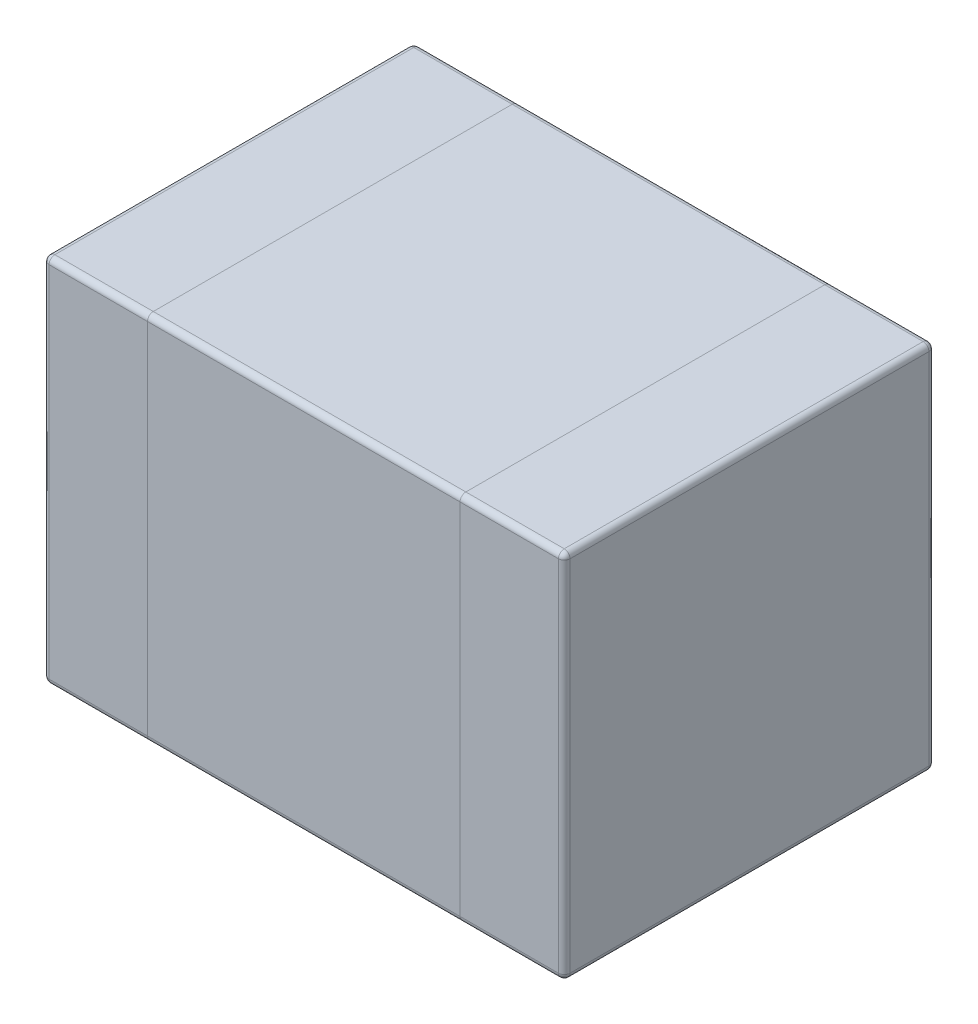
ISO-10303-21;
HEADER;
FILE_DESCRIPTION(('STEP AP214'),'2;1');
FILE_NAME('part.step','',(''),(''),'','','');
FILE_SCHEMA(('AUTOMOTIVE_DESIGN { 1 0 10303 214 1 1 1 1 }'));
ENDSEC;
DATA;
#1=APPLICATION_CONTEXT('core data for automotive mechanical design processes');
#2=APPLICATION_PROTOCOL_DEFINITION('international standard','automotive_design',2000,#1);
#3=PRODUCT_CONTEXT('',#1,'mechanical');
#4=PRODUCT('Part','Part','',(#3));
#5=PRODUCT_RELATED_PRODUCT_CATEGORY('part','',(#4));
#6=PRODUCT_DEFINITION_FORMATION('','',#4);
#7=PRODUCT_DEFINITION_CONTEXT('part definition',#1,'design');
#8=PRODUCT_DEFINITION('design','',#6,#7);
#9=PRODUCT_DEFINITION_SHAPE('','',#8);
#10=(LENGTH_UNIT() NAMED_UNIT(*) SI_UNIT(.MILLI.,.METRE.));
#11=(NAMED_UNIT(*) PLANE_ANGLE_UNIT() SI_UNIT($,.RADIAN.));
#12=(NAMED_UNIT(*) SI_UNIT($,.STERADIAN.) SOLID_ANGLE_UNIT());
#13=UNCERTAINTY_MEASURE_WITH_UNIT(LENGTH_MEASURE(1.E-05),#10,'distance_accuracy_value','');
#14=(GEOMETRIC_REPRESENTATION_CONTEXT(3) GLOBAL_UNCERTAINTY_ASSIGNED_CONTEXT((#13)) GLOBAL_UNIT_ASSIGNED_CONTEXT((#10,
#11,#12)) REPRESENTATION_CONTEXT('',''));
#15=CARTESIAN_POINT('',(0.,0.,0.));
#16=DIRECTION('',(0.,0.,1.));
#17=DIRECTION('',(1.,0.,0.));
#18=AXIS2_PLACEMENT_3D('',#15,#16,#17);
#19=CARTESIAN_POINT('',(2.25,3.2,-1.6));
#20=DIRECTION('',(0.,-1.,0.));
#21=DIRECTION('',(0.,0.,-1.));
#22=AXIS2_PLACEMENT_3D('',#19,#20,#21);
#23=PLANE('',#22);
#24=DIRECTION('',(0.,0.,1.));
#25=VECTOR('',#24,1.);
#26=CARTESIAN_POINT('',(-1.35,3.2,-1.6));
#27=LINE('',#26,#25);
#28=CARTESIAN_POINT('',(-1.35,3.2,-1.55));
#29=VERTEX_POINT('',#28);
#30=CARTESIAN_POINT('',(-1.35,3.2,1.55));
#31=VERTEX_POINT('',#30);
#32=EDGE_CURVE('E11',#29,#31,#27,.T.);
#33=ORIENTED_EDGE('',*,*,#32,.F.);
#34=DIRECTION('',(-1.,0.,0.));
#35=VECTOR('',#34,1.);
#36=CARTESIAN_POINT('',(2.25,3.2,-1.55));
#37=LINE('',#36,#35);
#38=CARTESIAN_POINT('',(-2.2,3.2,-1.55));
#39=VERTEX_POINT('',#38);
#40=EDGE_CURVE('E255',#29,#39,#37,.T.);
#41=ORIENTED_EDGE('',*,*,#40,.T.);
#42=DIRECTION('',(0.,0.,1.));
#43=VECTOR('',#42,1.);
#44=CARTESIAN_POINT('',(-2.2,3.2,-1.6));
#45=LINE('',#44,#43);
#46=CARTESIAN_POINT('',(-2.2,3.2,1.55));
#47=VERTEX_POINT('',#46);
#48=EDGE_CURVE('E258',#39,#47,#45,.T.);
#49=ORIENTED_EDGE('',*,*,#48,.T.);
#50=DIRECTION('',(1.,0.,0.));
#51=VECTOR('',#50,1.);
#52=CARTESIAN_POINT('',(2.25,3.2,1.55));
#53=LINE('',#52,#51);
#54=EDGE_CURVE('E262',#47,#31,#53,.T.);
#55=ORIENTED_EDGE('',*,*,#54,.T.);
#56=EDGE_LOOP('',(#33,#41,#49,#55));
#57=FACE_BOUND('',#56,.T.);
#58=ADVANCED_FACE('F39',(#57),#23,.F.);
#59=DIRECTION('',(0.,0.,-1.));
#60=VECTOR('',#59,1.);
#61=CARTESIAN_POINT('',(1.35,3.2,-1.6));
#62=LINE('',#61,#60);
#63=CARTESIAN_POINT('',(1.35,3.2,1.55));
#64=VERTEX_POINT('',#63);
#65=CARTESIAN_POINT('',(1.35,3.2,-1.55));
#66=VERTEX_POINT('',#65);
#67=EDGE_CURVE('E49',#64,#66,#62,.T.);
#68=ORIENTED_EDGE('',*,*,#67,.F.);
#69=CARTESIAN_POINT('',(2.2,3.2,1.55));
#70=VERTEX_POINT('',#69);
#71=EDGE_CURVE('E261',#64,#70,#53,.T.);
#72=ORIENTED_EDGE('',*,*,#71,.T.);
#73=DIRECTION('',(0.,0.,-1.));
#74=VECTOR('',#73,1.);
#75=CARTESIAN_POINT('',(2.2,3.2,-1.6));
#76=LINE('',#75,#74);
#77=CARTESIAN_POINT('',(2.2,3.2,-1.55));
#78=VERTEX_POINT('',#77);
#79=EDGE_CURVE('E252',#70,#78,#76,.T.);
#80=ORIENTED_EDGE('',*,*,#79,.T.);
#81=EDGE_CURVE('E256',#78,#66,#37,.T.);
#82=ORIENTED_EDGE('',*,*,#81,.T.);
#83=EDGE_LOOP('',(#68,#72,#80,#82));
#84=FACE_BOUND('',#83,.T.);
#85=ADVANCED_FACE('F528',(#84),#23,.F.);
#86=CARTESIAN_POINT('',(2.25,3.15,1.55));
#87=DIRECTION('',(1.,0.,0.));
#88=DIRECTION('',(0.,0.,-1.));
#89=AXIS2_PLACEMENT_3D('',#86,#87,#88);
#90=CYLINDRICAL_SURFACE('',#89,0.05);
#91=DIRECTION('',(1.,0.,0.));
#92=VECTOR('',#91,1.);
#93=CARTESIAN_POINT('',(-2.25,3.15,1.6));
#94=LINE('',#93,#92);
#95=CARTESIAN_POINT('',(-1.35,3.15,1.6));
#96=VERTEX_POINT('',#95);
#97=CARTESIAN_POINT('',(-2.2,3.15,1.6));
#98=VERTEX_POINT('',#97);
#99=EDGE_CURVE('E248',#96,#98,#94,.F.);
#100=ORIENTED_EDGE('',*,*,#99,.F.);
#101=CARTESIAN_POINT('',(-1.35,3.15,1.55));
#102=DIRECTION('',(1.,0.,0.));
#103=DIRECTION('',(0.,0.,-1.));
#104=AXIS2_PLACEMENT_3D('',#101,#102,#103);
#105=CIRCLE('',#104,0.05);
#106=EDGE_CURVE('E356',#96,#31,#105,.F.);
#107=ORIENTED_EDGE('',*,*,#106,.T.);
#108=ORIENTED_EDGE('',*,*,#54,.F.);
#109=CARTESIAN_POINT('',(-2.2,3.15,1.55));
#110=DIRECTION('',(-1.,0.,0.));
#111=DIRECTION('',(0.,-1.,0.));
#112=AXIS2_PLACEMENT_3D('',#109,#110,#111);
#113=CIRCLE('',#112,0.05);
#114=EDGE_CURVE('E332',#47,#98,#113,.F.);
#115=ORIENTED_EDGE('',*,*,#114,.T.);
#116=EDGE_LOOP('',(#100,#107,#108,#115));
#117=FACE_BOUND('',#116,.T.);
#118=ADVANCED_FACE('F485',(#117),#90,.T.);
#119=ORIENTED_EDGE('',*,*,#71,.F.);
#120=CARTESIAN_POINT('',(1.35,3.15,1.55));
#121=DIRECTION('',(-1.,0.,0.));
#122=DIRECTION('',(0.,0.,1.));
#123=AXIS2_PLACEMENT_3D('',#120,#121,#122);
#124=CIRCLE('',#123,0.05);
#125=CARTESIAN_POINT('',(1.35,3.15,1.6));
#126=VERTEX_POINT('',#125);
#127=EDGE_CURVE('E355',#64,#126,#124,.F.);
#128=ORIENTED_EDGE('',*,*,#127,.T.);
#129=CARTESIAN_POINT('',(2.2,3.15,1.6));
#130=VERTEX_POINT('',#129);
#131=EDGE_CURVE('E249',#130,#126,#94,.F.);
#132=ORIENTED_EDGE('',*,*,#131,.F.);
#133=CARTESIAN_POINT('',(2.2,3.15,1.55));
#134=DIRECTION('',(1.,0.,0.));
#135=DIRECTION('',(0.,0.,-1.));
#136=AXIS2_PLACEMENT_3D('',#133,#134,#135);
#137=CIRCLE('',#136,0.05);
#138=EDGE_CURVE('E317',#70,#130,#137,.T.);
#139=ORIENTED_EDGE('',*,*,#138,.F.);
#140=EDGE_LOOP('',(#119,#128,#132,#139));
#141=FACE_BOUND('',#140,.T.);
#142=ADVANCED_FACE('F459',(#141),#90,.T.);
#143=CARTESIAN_POINT('',(-2.25,3.2,1.6));
#144=DIRECTION('',(0.,0.,-1.));
#145=DIRECTION('',(-1.,0.,0.));
#146=AXIS2_PLACEMENT_3D('',#143,#144,#145);
#147=PLANE('',#146);
#148=DIRECTION('',(0.,-1.,0.));
#149=VECTOR('',#148,1.);
#150=CARTESIAN_POINT('',(-1.35,3.2,1.6));
#151=LINE('',#150,#149);
#152=CARTESIAN_POINT('',(-1.35,0.0500000000000001,1.6));
#153=VERTEX_POINT('',#152);
#154=EDGE_CURVE('E351',#96,#153,#151,.T.);
#155=ORIENTED_EDGE('',*,*,#154,.F.);
#156=ORIENTED_EDGE('',*,*,#99,.T.);
#157=DIRECTION('',(0.,-1.,0.));
#158=VECTOR('',#157,1.);
#159=CARTESIAN_POINT('',(-2.2,3.2,1.6));
#160=LINE('',#159,#158);
#161=CARTESIAN_POINT('',(-2.2,0.0500000000000001,1.6));
#162=VERTEX_POINT('',#161);
#163=EDGE_CURVE('E245',#98,#162,#160,.T.);
#164=ORIENTED_EDGE('',*,*,#163,.T.);
#165=DIRECTION('',(1.,0.,0.));
#166=VECTOR('',#165,1.);
#167=CARTESIAN_POINT('',(2.25,0.0500000000000001,1.6));
#168=LINE('',#167,#166);
#169=EDGE_CURVE('E239',#162,#153,#168,.T.);
#170=ORIENTED_EDGE('',*,*,#169,.T.);
#171=EDGE_LOOP('',(#155,#156,#164,#170));
#172=FACE_BOUND('',#171,.T.);
#173=ADVANCED_FACE('F473',(#172),#147,.F.);
#174=DIRECTION('',(0.,1.,0.));
#175=VECTOR('',#174,1.);
#176=CARTESIAN_POINT('',(1.35,3.2,1.6));
#177=LINE('',#176,#175);
#178=CARTESIAN_POINT('',(1.35,0.0500000000000001,1.6));
#179=VERTEX_POINT('',#178);
#180=EDGE_CURVE('E347',#179,#126,#177,.T.);
#181=ORIENTED_EDGE('',*,*,#180,.F.);
#182=CARTESIAN_POINT('',(2.2,0.0500000000000001,1.6));
#183=VERTEX_POINT('',#182);
#184=EDGE_CURVE('E238',#179,#183,#168,.T.);
#185=ORIENTED_EDGE('',*,*,#184,.T.);
#186=DIRECTION('',(0.,-1.,0.));
#187=VECTOR('',#186,1.);
#188=CARTESIAN_POINT('',(2.2,3.2,1.6));
#189=LINE('',#188,#187);
#190=EDGE_CURVE('E242',#183,#130,#189,.F.);
#191=ORIENTED_EDGE('',*,*,#190,.T.);
#192=ORIENTED_EDGE('',*,*,#131,.T.);
#193=EDGE_LOOP('',(#181,#185,#191,#192));
#194=FACE_BOUND('',#193,.T.);
#195=ADVANCED_FACE('F455',(#194),#147,.F.);
#196=CARTESIAN_POINT('',(-2.25,0.0500000000000001,1.55));
#197=DIRECTION('',(-1.,0.,0.));
#198=DIRECTION('',(0.,0.,1.));
#199=AXIS2_PLACEMENT_3D('',#196,#197,#198);
#200=CYLINDRICAL_SURFACE('',#199,0.05);
#201=DIRECTION('',(1.,0.,0.));
#202=VECTOR('',#201,1.);
#203=CARTESIAN_POINT('',(-2.25,0.,1.55));
#204=LINE('',#203,#202);
#205=CARTESIAN_POINT('',(-1.35,0.,1.55));
#206=VERTEX_POINT('',#205);
#207=CARTESIAN_POINT('',(-2.2,0.,1.55));
#208=VERTEX_POINT('',#207);
#209=EDGE_CURVE('E268',#206,#208,#204,.F.);
#210=ORIENTED_EDGE('',*,*,#209,.F.);
#211=CARTESIAN_POINT('',(-1.35,0.0500000000000001,1.55));
#212=DIRECTION('',(1.,0.,0.));
#213=DIRECTION('',(0.,0.,-1.));
#214=AXIS2_PLACEMENT_3D('',#211,#212,#213);
#215=CIRCLE('',#214,0.05);
#216=EDGE_CURVE('E352',#206,#153,#215,.F.);
#217=ORIENTED_EDGE('',*,*,#216,.T.);
#218=ORIENTED_EDGE('',*,*,#169,.F.);
#219=CARTESIAN_POINT('',(-2.2,0.05,1.55));
#220=DIRECTION('',(-1.,0.,0.));
#221=DIRECTION('',(0.,0.,1.));
#222=AXIS2_PLACEMENT_3D('',#219,#220,#221);
#223=CIRCLE('',#222,0.05);
#224=EDGE_CURVE('E323',#162,#208,#223,.F.);
#225=ORIENTED_EDGE('',*,*,#224,.T.);
#226=EDGE_LOOP('',(#210,#217,#218,#225));
#227=FACE_BOUND('',#226,.T.);
#228=ADVANCED_FACE('F511',(#227),#200,.T.);
#229=ORIENTED_EDGE('',*,*,#184,.F.);
#230=CARTESIAN_POINT('',(1.35,0.0500000000000001,1.55));
#231=DIRECTION('',(-1.,0.,0.));
#232=DIRECTION('',(0.,0.,1.));
#233=AXIS2_PLACEMENT_3D('',#230,#231,#232);
#234=CIRCLE('',#233,0.05);
#235=CARTESIAN_POINT('',(1.35,0.,1.55));
#236=VERTEX_POINT('',#235);
#237=EDGE_CURVE('E367',#179,#236,#234,.F.);
#238=ORIENTED_EDGE('',*,*,#237,.T.);
#239=CARTESIAN_POINT('',(2.2,0.,1.55));
#240=VERTEX_POINT('',#239);
#241=EDGE_CURVE('E269',#240,#236,#204,.F.);
#242=ORIENTED_EDGE('',*,*,#241,.F.);
#243=CARTESIAN_POINT('',(2.2,0.0500000000000001,1.55));
#244=DIRECTION('',(1.,0.,0.));
#245=DIRECTION('',(0.,0.,-1.));
#246=AXIS2_PLACEMENT_3D('',#243,#244,#245);
#247=CIRCLE('',#246,0.05);
#248=EDGE_CURVE('E303',#183,#240,#247,.T.);
#249=ORIENTED_EDGE('',*,*,#248,.F.);
#250=EDGE_LOOP('',(#229,#238,#242,#249));
#251=FACE_BOUND('',#250,.T.);
#252=ADVANCED_FACE('F445',(#251),#200,.T.);
#253=CARTESIAN_POINT('',(2.25,0.,-1.6));
#254=DIRECTION('',(0.,-1.,0.));
#255=DIRECTION('',(0.,0.,-1.));
#256=AXIS2_PLACEMENT_3D('',#253,#254,#255);
#257=PLANE('',#256);
#258=DIRECTION('',(-1.,0.,0.));
#259=VECTOR('',#258,1.);
#260=CARTESIAN_POINT('',(2.25,0.,-1.55));
#261=LINE('',#260,#259);
#262=CARTESIAN_POINT('',(-2.2,0.,-1.55));
#263=VERTEX_POINT('',#262);
#264=CARTESIAN_POINT('',(-1.35,0.,-1.55));
#265=VERTEX_POINT('',#264);
#266=EDGE_CURVE('E276',#263,#265,#261,.F.);
#267=ORIENTED_EDGE('',*,*,#266,.T.);
#268=DIRECTION('',(0.,0.,1.));
#269=VECTOR('',#268,1.);
#270=CARTESIAN_POINT('',(-1.35,0.,-1.6));
#271=LINE('',#270,#269);
#272=EDGE_CURVE('E368',#265,#206,#271,.T.);
#273=ORIENTED_EDGE('',*,*,#272,.T.);
#274=ORIENTED_EDGE('',*,*,#209,.T.);
#275=DIRECTION('',(0.,0.,1.));
#276=VECTOR('',#275,1.);
#277=CARTESIAN_POINT('',(-2.2,0.,-1.6));
#278=LINE('',#277,#276);
#279=EDGE_CURVE('E272',#208,#263,#278,.F.);
#280=ORIENTED_EDGE('',*,*,#279,.T.);
#281=EDGE_LOOP('',(#267,#273,#274,#280));
#282=FACE_BOUND('',#281,.T.);
#283=ADVANCED_FACE('F514',(#282),#257,.T.);
#284=ORIENTED_EDGE('',*,*,#241,.T.);
#285=DIRECTION('',(0.,0.,-1.));
#286=VECTOR('',#285,1.);
#287=CARTESIAN_POINT('',(1.35,0.,-1.6));
#288=LINE('',#287,#286);
#289=CARTESIAN_POINT('',(1.35,0.,-1.55));
#290=VERTEX_POINT('',#289);
#291=EDGE_CURVE('E362',#236,#290,#288,.T.);
#292=ORIENTED_EDGE('',*,*,#291,.T.);
#293=CARTESIAN_POINT('',(2.2,0.,-1.55));
#294=VERTEX_POINT('',#293);
#295=EDGE_CURVE('E275',#290,#294,#261,.F.);
#296=ORIENTED_EDGE('',*,*,#295,.T.);
#297=DIRECTION('',(0.,0.,-1.));
#298=VECTOR('',#297,1.);
#299=CARTESIAN_POINT('',(2.2,0.,1.6));
#300=LINE('',#299,#298);
#301=EDGE_CURVE('E265',#294,#240,#300,.F.);
#302=ORIENTED_EDGE('',*,*,#301,.T.);
#303=EDGE_LOOP('',(#284,#292,#296,#302));
#304=FACE_BOUND('',#303,.T.);
#305=ADVANCED_FACE('F389',(#304),#257,.T.);
#306=CARTESIAN_POINT('',(2.25,3.15,-1.55));
#307=DIRECTION('',(-1.,0.,0.));
#308=DIRECTION('',(0.,0.,1.));
#309=AXIS2_PLACEMENT_3D('',#306,#307,#308);
#310=CYLINDRICAL_SURFACE('',#309,0.05);
#311=ORIENTED_EDGE('',*,*,#40,.F.);
#312=CARTESIAN_POINT('',(-1.35,3.15,-1.55));
#313=DIRECTION('',(1.,0.,0.));
#314=DIRECTION('',(0.,0.,-1.));
#315=AXIS2_PLACEMENT_3D('',#312,#313,#314);
#316=CIRCLE('',#315,0.05);
#317=CARTESIAN_POINT('',(-1.35,3.15,-1.6));
#318=VERTEX_POINT('',#317);
#319=EDGE_CURVE('E359',#29,#318,#316,.F.);
#320=ORIENTED_EDGE('',*,*,#319,.T.);
#321=DIRECTION('',(-1.,0.,0.));
#322=VECTOR('',#321,1.);
#323=CARTESIAN_POINT('',(-2.25,3.15,-1.6));
#324=LINE('',#323,#322);
#325=CARTESIAN_POINT('',(-2.2,3.15,-1.6));
#326=VERTEX_POINT('',#325);
#327=EDGE_CURVE('E218',#326,#318,#324,.F.);
#328=ORIENTED_EDGE('',*,*,#327,.F.);
#329=CARTESIAN_POINT('',(-2.2,3.15,-1.55));
#330=DIRECTION('',(-1.,0.,0.));
#331=DIRECTION('',(0.,0.,1.));
#332=AXIS2_PLACEMENT_3D('',#329,#330,#331);
#333=CIRCLE('',#332,0.05);
#334=EDGE_CURVE('E294',#326,#39,#333,.F.);
#335=ORIENTED_EDGE('',*,*,#334,.T.);
#336=EDGE_LOOP('',(#311,#320,#328,#335));
#337=FACE_BOUND('',#336,.T.);
#338=ADVANCED_FACE('F521',(#337),#310,.T.);
#339=CARTESIAN_POINT('',(1.35,3.15,-1.6));
#340=VERTEX_POINT('',#339);
#341=CARTESIAN_POINT('',(2.2,3.15,-1.6));
#342=VERTEX_POINT('',#341);
#343=EDGE_CURVE('E213',#340,#342,#324,.F.);
#344=ORIENTED_EDGE('',*,*,#343,.F.);
#345=CARTESIAN_POINT('',(1.35,3.15,-1.55));
#346=DIRECTION('',(-1.,0.,0.));
#347=DIRECTION('',(0.,0.,1.));
#348=AXIS2_PLACEMENT_3D('',#345,#346,#347);
#349=CIRCLE('',#348,0.05);
#350=EDGE_CURVE('E363',#340,#66,#349,.F.);
#351=ORIENTED_EDGE('',*,*,#350,.T.);
#352=ORIENTED_EDGE('',*,*,#81,.F.);
#353=CARTESIAN_POINT('',(2.2,3.15,-1.55));
#354=DIRECTION('',(1.,0.,0.));
#355=DIRECTION('',(0.,0.,-1.));
#356=AXIS2_PLACEMENT_3D('',#353,#354,#355);
#357=CIRCLE('',#356,0.05);
#358=EDGE_CURVE('E198',#342,#78,#357,.T.);
#359=ORIENTED_EDGE('',*,*,#358,.F.);
#360=EDGE_LOOP('',(#344,#351,#352,#359));
#361=FACE_BOUND('',#360,.T.);
#362=ADVANCED_FACE('F424',(#361),#310,.T.);
#363=CARTESIAN_POINT('',(-2.25,0.0500000000000001,-1.55));
#364=DIRECTION('',(1.,0.,0.));
#365=DIRECTION('',(0.,0.,-1.));
#366=AXIS2_PLACEMENT_3D('',#363,#364,#365);
#367=CYLINDRICAL_SURFACE('',#366,0.05);
#368=DIRECTION('',(-1.,0.,0.));
#369=VECTOR('',#368,1.);
#370=CARTESIAN_POINT('',(-2.25,0.0500000000000001,-1.6));
#371=LINE('',#370,#369);
#372=CARTESIAN_POINT('',(-1.35,0.0500000000000001,-1.6));
#373=VERTEX_POINT('',#372);
#374=CARTESIAN_POINT('',(-2.2,0.0500000000000001,-1.6));
#375=VERTEX_POINT('',#374);
#376=EDGE_CURVE('E210',#373,#375,#371,.T.);
#377=ORIENTED_EDGE('',*,*,#376,.F.);
#378=CARTESIAN_POINT('',(-1.35,0.0500000000000001,-1.55));
#379=DIRECTION('',(1.,0.,0.));
#380=DIRECTION('',(0.,0.,-1.));
#381=AXIS2_PLACEMENT_3D('',#378,#379,#380);
#382=CIRCLE('',#381,0.05);
#383=EDGE_CURVE('E372',#373,#265,#382,.F.);
#384=ORIENTED_EDGE('',*,*,#383,.T.);
#385=ORIENTED_EDGE('',*,*,#266,.F.);
#386=CARTESIAN_POINT('',(-2.2,0.0500000000000001,-1.55));
#387=DIRECTION('',(-1.,0.,0.));
#388=DIRECTION('',(0.,0.,1.));
#389=AXIS2_PLACEMENT_3D('',#386,#387,#388);
#390=CIRCLE('',#389,0.05);
#391=EDGE_CURVE('E291',#263,#375,#390,.F.);
#392=ORIENTED_EDGE('',*,*,#391,.T.);
#393=EDGE_LOOP('',(#377,#384,#385,#392));
#394=FACE_BOUND('',#393,.T.);
#395=ADVANCED_FACE('F407',(#394),#367,.T.);
#396=ORIENTED_EDGE('',*,*,#295,.F.);
#397=CARTESIAN_POINT('',(1.35,0.0500000000000001,-1.55));
#398=DIRECTION('',(-1.,0.,0.));
#399=DIRECTION('',(0.,0.,1.));
#400=AXIS2_PLACEMENT_3D('',#397,#398,#399);
#401=CIRCLE('',#400,0.05);
#402=CARTESIAN_POINT('',(1.35,0.0500000000000001,-1.6));
#403=VERTEX_POINT('',#402);
#404=EDGE_CURVE('E43',#290,#403,#401,.F.);
#405=ORIENTED_EDGE('',*,*,#404,.T.);
#406=CARTESIAN_POINT('',(2.2,0.0500000000000001,-1.6));
#407=VERTEX_POINT('',#406);
#408=EDGE_CURVE('E201',#407,#403,#371,.T.);
#409=ORIENTED_EDGE('',*,*,#408,.F.);
#410=CARTESIAN_POINT('',(2.2,0.05,-1.55));
#411=DIRECTION('',(1.,0.,0.));
#412=DIRECTION('',(0.,0.,-1.));
#413=AXIS2_PLACEMENT_3D('',#410,#411,#412);
#414=CIRCLE('',#413,0.05);
#415=EDGE_CURVE('E190',#294,#407,#414,.T.);
#416=ORIENTED_EDGE('',*,*,#415,.F.);
#417=EDGE_LOOP('',(#396,#405,#409,#416));
#418=FACE_BOUND('',#417,.T.);
#419=ADVANCED_FACE('F202',(#418),#367,.T.);
#420=CARTESIAN_POINT('',(-2.25,3.2,-1.6));
#421=DIRECTION('',(0.,0.,1.));
#422=DIRECTION('',(1.,0.,0.));
#423=AXIS2_PLACEMENT_3D('',#420,#421,#422);
#424=PLANE('',#423);
#425=DIRECTION('',(0.,1.,0.));
#426=VECTOR('',#425,1.);
#427=CARTESIAN_POINT('',(-1.35,3.2,-1.6));
#428=LINE('',#427,#426);
#429=EDGE_CURVE('E343',#373,#318,#428,.T.);
#430=ORIENTED_EDGE('',*,*,#429,.F.);
#431=ORIENTED_EDGE('',*,*,#376,.T.);
#432=DIRECTION('',(0.,-1.,0.));
#433=VECTOR('',#432,1.);
#434=CARTESIAN_POINT('',(-2.2,3.2,-1.6));
#435=LINE('',#434,#433);
#436=EDGE_CURVE('E207',#375,#326,#435,.F.);
#437=ORIENTED_EDGE('',*,*,#436,.T.);
#438=ORIENTED_EDGE('',*,*,#327,.T.);
#439=EDGE_LOOP('',(#430,#431,#437,#438));
#440=FACE_BOUND('',#439,.T.);
#441=ADVANCED_FACE('F410',(#440),#424,.F.);
#442=DIRECTION('',(0.,-1.,0.));
#443=VECTOR('',#442,1.);
#444=CARTESIAN_POINT('',(1.35,3.2,-1.6));
#445=LINE('',#444,#443);
#446=EDGE_CURVE('E278',#340,#403,#445,.T.);
#447=ORIENTED_EDGE('',*,*,#446,.F.);
#448=ORIENTED_EDGE('',*,*,#343,.T.);
#449=DIRECTION('',(0.,-1.,0.));
#450=VECTOR('',#449,1.);
#451=CARTESIAN_POINT('',(2.2,3.2,-1.6));
#452=LINE('',#451,#450);
#453=EDGE_CURVE('E182',#342,#407,#452,.T.);
#454=ORIENTED_EDGE('',*,*,#453,.T.);
#455=ORIENTED_EDGE('',*,*,#408,.T.);
#456=EDGE_LOOP('',(#447,#448,#454,#455));
#457=FACE_BOUND('',#456,.T.);
#458=ADVANCED_FACE('F211',(#457),#424,.F.);
#459=CARTESIAN_POINT('',(2.25,3.2,1.6));
#460=DIRECTION('',(-1.,0.,0.));
#461=DIRECTION('',(0.,0.,1.));
#462=AXIS2_PLACEMENT_3D('',#459,#460,#461);
#463=PLANE('',#462);
#464=DIRECTION('',(0.,-1.,0.));
#465=VECTOR('',#464,1.);
#466=CARTESIAN_POINT('',(2.25,3.2,-1.55));
#467=LINE('',#466,#465);
#468=CARTESIAN_POINT('',(2.25,0.0500000000000001,-1.55));
#469=VERTEX_POINT('',#468);
#470=CARTESIAN_POINT('',(2.25,3.15,-1.55));
#471=VERTEX_POINT('',#470);
#472=EDGE_CURVE('E184',#469,#471,#467,.F.);
#473=ORIENTED_EDGE('',*,*,#472,.T.);
#474=DIRECTION('',(0.,0.,-1.));
#475=VECTOR('',#474,1.);
#476=CARTESIAN_POINT('',(2.25,3.15,1.6));
#477=LINE('',#476,#475);
#478=CARTESIAN_POINT('',(2.25,3.15,1.55));
#479=VERTEX_POINT('',#478);
#480=EDGE_CURVE('E227',#471,#479,#477,.F.);
#481=ORIENTED_EDGE('',*,*,#480,.T.);
#482=DIRECTION('',(0.,-1.,0.));
#483=VECTOR('',#482,1.);
#484=CARTESIAN_POINT('',(2.25,3.2,1.55));
#485=LINE('',#484,#483);
#486=CARTESIAN_POINT('',(2.25,0.0500000000000001,1.55));
#487=VERTEX_POINT('',#486);
#488=EDGE_CURVE('E224',#479,#487,#485,.T.);
#489=ORIENTED_EDGE('',*,*,#488,.T.);
#490=DIRECTION('',(0.,0.,-1.));
#491=VECTOR('',#490,1.);
#492=CARTESIAN_POINT('',(2.25,0.0500000000000001,-1.6));
#493=LINE('',#492,#491);
#494=EDGE_CURVE('E222',#487,#469,#493,.T.);
#495=ORIENTED_EDGE('',*,*,#494,.T.);
#496=EDGE_LOOP('',(#473,#481,#489,#495));
#497=FACE_BOUND('',#496,.T.);
#498=ADVANCED_FACE('F436',(#497),#463,.F.);
#499=EDGE_CURVE('E208',#403,#373,#371,.T.);
#500=ORIENTED_EDGE('',*,*,#499,.T.);
#501=ORIENTED_EDGE('',*,*,#429,.T.);
#502=EDGE_CURVE('E216',#318,#340,#324,.F.);
#503=ORIENTED_EDGE('',*,*,#502,.T.);
#504=ORIENTED_EDGE('',*,*,#446,.T.);
#505=EDGE_LOOP('',(#500,#501,#503,#504));
#506=FACE_BOUND('',#505,.T.);
#507=ADVANCED_FACE('F416',(#506),#424,.F.);
#508=CARTESIAN_POINT('',(-2.25,3.2,1.6));
#509=DIRECTION('',(1.,0.,0.));
#510=DIRECTION('',(0.,0.,-1.));
#511=AXIS2_PLACEMENT_3D('',#508,#509,#510);
#512=PLANE('',#511);
#513=DIRECTION('',(0.,-1.,0.));
#514=VECTOR('',#513,1.);
#515=CARTESIAN_POINT('',(-2.25,3.2,1.55));
#516=LINE('',#515,#514);
#517=CARTESIAN_POINT('',(-2.25,0.0500000000000001,1.55));
#518=VERTEX_POINT('',#517);
#519=CARTESIAN_POINT('',(-2.25,3.15,1.55));
#520=VERTEX_POINT('',#519);
#521=EDGE_CURVE('E231',#518,#520,#516,.F.);
#522=ORIENTED_EDGE('',*,*,#521,.T.);
#523=DIRECTION('',(0.,0.,1.));
#524=VECTOR('',#523,1.);
#525=CARTESIAN_POINT('',(-2.25,3.15,1.6));
#526=LINE('',#525,#524);
#527=CARTESIAN_POINT('',(-2.25,3.15,-1.55));
#528=VERTEX_POINT('',#527);
#529=EDGE_CURVE('E236',#520,#528,#526,.F.);
#530=ORIENTED_EDGE('',*,*,#529,.T.);
#531=DIRECTION('',(0.,-1.,0.));
#532=VECTOR('',#531,1.);
#533=CARTESIAN_POINT('',(-2.25,3.2,-1.55));
#534=LINE('',#533,#532);
#535=CARTESIAN_POINT('',(-2.25,0.0500000000000001,-1.55));
#536=VERTEX_POINT('',#535);
#537=EDGE_CURVE('E233',#528,#536,#534,.T.);
#538=ORIENTED_EDGE('',*,*,#537,.T.);
#539=DIRECTION('',(0.,0.,1.));
#540=VECTOR('',#539,1.);
#541=CARTESIAN_POINT('',(-2.25,0.0500000000000001,1.6));
#542=LINE('',#541,#540);
#543=EDGE_CURVE('E229',#536,#518,#542,.T.);
#544=ORIENTED_EDGE('',*,*,#543,.T.);
#545=EDGE_LOOP('',(#522,#530,#538,#544));
#546=FACE_BOUND('',#545,.T.);
#547=ADVANCED_FACE('F493',(#546),#512,.F.);
#548=EDGE_CURVE('E253',#126,#96,#94,.F.);
#549=ORIENTED_EDGE('',*,*,#548,.T.);
#550=ORIENTED_EDGE('',*,*,#154,.T.);
#551=EDGE_CURVE('E243',#153,#179,#168,.T.);
#552=ORIENTED_EDGE('',*,*,#551,.T.);
#553=ORIENTED_EDGE('',*,*,#180,.T.);
#554=EDGE_LOOP('',(#549,#550,#552,#553));
#555=FACE_BOUND('',#554,.T.);
#556=ADVANCED_FACE('F466',(#555),#147,.F.);
#557=EDGE_CURVE('E259',#66,#29,#37,.T.);
#558=ORIENTED_EDGE('',*,*,#557,.T.);
#559=ORIENTED_EDGE('',*,*,#32,.T.);
#560=EDGE_CURVE('E266',#31,#64,#53,.T.);
#561=ORIENTED_EDGE('',*,*,#560,.T.);
#562=ORIENTED_EDGE('',*,*,#67,.T.);
#563=EDGE_LOOP('',(#558,#559,#561,#562));
#564=FACE_BOUND('',#563,.T.);
#565=ADVANCED_FACE('F526',(#564),#23,.F.);
#566=ORIENTED_EDGE('',*,*,#272,.F.);
#567=EDGE_CURVE('E279',#265,#290,#261,.F.);
#568=ORIENTED_EDGE('',*,*,#567,.T.);
#569=ORIENTED_EDGE('',*,*,#291,.F.);
#570=EDGE_CURVE('E273',#236,#206,#204,.F.);
#571=ORIENTED_EDGE('',*,*,#570,.T.);
#572=EDGE_LOOP('',(#566,#568,#569,#571));
#573=FACE_BOUND('',#572,.T.);
#574=ADVANCED_FACE('F401',(#573),#257,.T.);
#575=CARTESIAN_POINT('',(-2.2,3.2,1.55));
#576=DIRECTION('',(0.,-1.,0.));
#577=DIRECTION('',(0.,0.,-1.));
#578=AXIS2_PLACEMENT_3D('',#575,#576,#577);
#579=CYLINDRICAL_SURFACE('',#578,0.05);
#580=CARTESIAN_POINT('',(-2.2,3.15,1.55));
#581=DIRECTION('',(0.,1.,0.));
#582=DIRECTION('',(0.,0.,1.));
#583=AXIS2_PLACEMENT_3D('',#580,#581,#582);
#584=CIRCLE('',#583,0.05);
#585=EDGE_CURVE('E338',#520,#98,#584,.T.);
#586=ORIENTED_EDGE('',*,*,#585,.F.);
#587=ORIENTED_EDGE('',*,*,#521,.F.);
#588=CARTESIAN_POINT('',(-2.2,0.0500000000000001,1.55));
#589=DIRECTION('',(0.,-1.,0.));
#590=DIRECTION('',(0.,0.,-1.));
#591=AXIS2_PLACEMENT_3D('',#588,#589,#590);
#592=CIRCLE('',#591,0.05);
#593=EDGE_CURVE('E335',#162,#518,#592,.T.);
#594=ORIENTED_EDGE('',*,*,#593,.F.);
#595=ORIENTED_EDGE('',*,*,#163,.F.);
#596=EDGE_LOOP('',(#586,#587,#594,#595));
#597=FACE_BOUND('',#596,.T.);
#598=ADVANCED_FACE('F41',(#597),#579,.T.);
#599=CARTESIAN_POINT('',(-2.2,3.15,1.55));
#600=DIRECTION('',(0.,0.,1.));
#601=DIRECTION('',(1.,0.,0.));
#602=AXIS2_PLACEMENT_3D('',#599,#600,#601);
#603=SPHERICAL_SURFACE('',#602,0.05);
#604=CARTESIAN_POINT('',(-2.2,3.15,1.55));
#605=DIRECTION('',(0.,0.,1.));
#606=DIRECTION('',(1.,0.,0.));
#607=AXIS2_PLACEMENT_3D('',#604,#605,#606);
#608=CIRCLE('',#607,0.05);
#609=EDGE_CURVE('E329',#520,#47,#608,.F.);
#610=ORIENTED_EDGE('',*,*,#609,.F.);
#611=ORIENTED_EDGE('',*,*,#585,.T.);
#612=ORIENTED_EDGE('',*,*,#114,.F.);
#613=EDGE_LOOP('',(#610,#611,#612));
#614=FACE_BOUND('',#613,.T.);
#615=ADVANCED_FACE('F482',(#614),#603,.T.);
#616=CARTESIAN_POINT('',(-2.2,0.05,1.55));
#617=DIRECTION('',(0.,0.,1.));
#618=DIRECTION('',(1.,0.,0.));
#619=AXIS2_PLACEMENT_3D('',#616,#617,#618);
#620=SPHERICAL_SURFACE('',#619,0.05);
#621=ORIENTED_EDGE('',*,*,#224,.F.);
#622=ORIENTED_EDGE('',*,*,#593,.T.);
#623=CARTESIAN_POINT('',(-2.2,0.0500000000000001,1.55));
#624=DIRECTION('',(0.,0.,1.));
#625=DIRECTION('',(1.,0.,0.));
#626=AXIS2_PLACEMENT_3D('',#623,#624,#625);
#627=CIRCLE('',#626,0.05);
#628=EDGE_CURVE('E326',#208,#518,#627,.F.);
#629=ORIENTED_EDGE('',*,*,#628,.F.);
#630=EDGE_LOOP('',(#621,#622,#629));
#631=FACE_BOUND('',#630,.T.);
#632=ADVANCED_FACE('F509',(#631),#620,.T.);
#633=ORIENTED_EDGE('',*,*,#106,.F.);
#634=ORIENTED_EDGE('',*,*,#548,.F.);
#635=ORIENTED_EDGE('',*,*,#127,.F.);
#636=ORIENTED_EDGE('',*,*,#560,.F.);
#637=EDGE_LOOP('',(#633,#634,#635,#636));
#638=FACE_BOUND('',#637,.T.);
#639=ADVANCED_FACE('F468',(#638),#90,.T.);
#640=CARTESIAN_POINT('',(-2.2,3.15,-1.6));
#641=DIRECTION('',(0.,0.,1.));
#642=DIRECTION('',(1.,0.,0.));
#643=AXIS2_PLACEMENT_3D('',#640,#641,#642);
#644=CYLINDRICAL_SURFACE('',#643,0.05);
#645=ORIENTED_EDGE('',*,*,#609,.T.);
#646=ORIENTED_EDGE('',*,*,#48,.F.);
#647=CARTESIAN_POINT('',(-2.2,3.15,-1.55));
#648=DIRECTION('',(0.,0.,-1.));
#649=DIRECTION('',(0.,1.,0.));
#650=AXIS2_PLACEMENT_3D('',#647,#648,#649);
#651=CIRCLE('',#650,0.05);
#652=EDGE_CURVE('E314',#528,#39,#651,.T.);
#653=ORIENTED_EDGE('',*,*,#652,.F.);
#654=ORIENTED_EDGE('',*,*,#529,.F.);
#655=EDGE_LOOP('',(#645,#646,#653,#654));
#656=FACE_BOUND('',#655,.T.);
#657=ADVANCED_FACE('F490',(#656),#644,.T.);
#658=CARTESIAN_POINT('',(-2.2,3.2,-1.55));
#659=DIRECTION('',(0.,-1.,0.));
#660=DIRECTION('',(0.,0.,-1.));
#661=AXIS2_PLACEMENT_3D('',#658,#659,#660);
#662=CYLINDRICAL_SURFACE('',#661,0.05);
#663=CARTESIAN_POINT('',(-2.2,0.0500000000000001,-1.55));
#664=DIRECTION('',(0.,-1.,0.));
#665=DIRECTION('',(0.,0.,-1.));
#666=AXIS2_PLACEMENT_3D('',#663,#664,#665);
#667=CIRCLE('',#666,0.05);
#668=EDGE_CURVE('E308',#536,#375,#667,.T.);
#669=ORIENTED_EDGE('',*,*,#668,.F.);
#670=ORIENTED_EDGE('',*,*,#537,.F.);
#671=CARTESIAN_POINT('',(-2.2,3.15,-1.55));
#672=DIRECTION('',(0.,1.,0.));
#673=DIRECTION('',(0.,0.,1.));
#674=AXIS2_PLACEMENT_3D('',#671,#672,#673);
#675=CIRCLE('',#674,0.05);
#676=EDGE_CURVE('E311',#326,#528,#675,.T.);
#677=ORIENTED_EDGE('',*,*,#676,.F.);
#678=ORIENTED_EDGE('',*,*,#436,.F.);
#679=EDGE_LOOP('',(#669,#670,#677,#678));
#680=FACE_BOUND('',#679,.T.);
#681=ADVANCED_FACE('F497',(#680),#662,.T.);
#682=CARTESIAN_POINT('',(-2.2,0.0500000000000001,1.6));
#683=DIRECTION('',(0.,0.,-1.));
#684=DIRECTION('',(-1.,0.,0.));
#685=AXIS2_PLACEMENT_3D('',#682,#683,#684);
#686=CYLINDRICAL_SURFACE('',#685,0.05);
#687=ORIENTED_EDGE('',*,*,#628,.T.);
#688=ORIENTED_EDGE('',*,*,#543,.F.);
#689=CARTESIAN_POINT('',(-2.2,0.05,-1.55));
#690=DIRECTION('',(0.,0.,-1.));
#691=DIRECTION('',(-1.,0.,0.));
#692=AXIS2_PLACEMENT_3D('',#689,#690,#691);
#693=CIRCLE('',#692,0.05);
#694=EDGE_CURVE('E306',#263,#536,#693,.T.);
#695=ORIENTED_EDGE('',*,*,#694,.F.);
#696=ORIENTED_EDGE('',*,*,#279,.F.);
#697=EDGE_LOOP('',(#687,#688,#695,#696));
#698=FACE_BOUND('',#697,.T.);
#699=ADVANCED_FACE('F504',(#698),#686,.T.);
#700=ORIENTED_EDGE('',*,*,#216,.F.);
#701=ORIENTED_EDGE('',*,*,#570,.F.);
#702=ORIENTED_EDGE('',*,*,#237,.F.);
#703=ORIENTED_EDGE('',*,*,#551,.F.);
#704=EDGE_LOOP('',(#700,#701,#702,#703));
#705=FACE_BOUND('',#704,.T.);
#706=ADVANCED_FACE('F513',(#705),#200,.T.);
#707=CARTESIAN_POINT('',(2.2,3.2,1.55));
#708=DIRECTION('',(0.,-1.,0.));
#709=DIRECTION('',(0.,0.,-1.));
#710=AXIS2_PLACEMENT_3D('',#707,#708,#709);
#711=CYLINDRICAL_SURFACE('',#710,0.05);
#712=CARTESIAN_POINT('',(2.2,3.15,1.55));
#713=DIRECTION('',(0.,1.,0.));
#714=DIRECTION('',(0.,0.,1.));
#715=AXIS2_PLACEMENT_3D('',#712,#713,#714);
#716=CIRCLE('',#715,0.05);
#717=EDGE_CURVE('E320',#130,#479,#716,.T.);
#718=ORIENTED_EDGE('',*,*,#717,.F.);
#719=ORIENTED_EDGE('',*,*,#190,.F.);
#720=CARTESIAN_POINT('',(2.2,0.0500000000000001,1.55));
#721=DIRECTION('',(0.,-1.,0.));
#722=DIRECTION('',(0.,0.,-1.));
#723=AXIS2_PLACEMENT_3D('',#720,#721,#722);
#724=CIRCLE('',#723,0.05);
#725=EDGE_CURVE('E300',#487,#183,#724,.T.);
#726=ORIENTED_EDGE('',*,*,#725,.F.);
#727=ORIENTED_EDGE('',*,*,#488,.F.);
#728=EDGE_LOOP('',(#718,#719,#726,#727));
#729=FACE_BOUND('',#728,.T.);
#730=ADVANCED_FACE('F452',(#729),#711,.T.);
#731=CARTESIAN_POINT('',(2.2,3.15,1.55));
#732=DIRECTION('',(0.,0.,1.));
#733=DIRECTION('',(1.,0.,0.));
#734=AXIS2_PLACEMENT_3D('',#731,#732,#733);
#735=SPHERICAL_SURFACE('',#734,0.05);
#736=ORIENTED_EDGE('',*,*,#138,.T.);
#737=ORIENTED_EDGE('',*,*,#717,.T.);
#738=CARTESIAN_POINT('',(2.2,3.15,1.55));
#739=DIRECTION('',(0.,0.,1.));
#740=DIRECTION('',(0.,-1.,0.));
#741=AXIS2_PLACEMENT_3D('',#738,#739,#740);
#742=CIRCLE('',#741,0.05);
#743=EDGE_CURVE('E297',#70,#479,#742,.F.);
#744=ORIENTED_EDGE('',*,*,#743,.F.);
#745=EDGE_LOOP('',(#736,#737,#744));
#746=FACE_BOUND('',#745,.T.);
#747=ADVANCED_FACE('F537',(#746),#735,.T.);
#748=CARTESIAN_POINT('',(-2.2,3.15,-1.55));
#749=DIRECTION('',(0.,0.,1.));
#750=DIRECTION('',(1.,0.,0.));
#751=AXIS2_PLACEMENT_3D('',#748,#749,#750);
#752=SPHERICAL_SURFACE('',#751,0.05);
#753=ORIENTED_EDGE('',*,*,#676,.T.);
#754=ORIENTED_EDGE('',*,*,#652,.T.);
#755=ORIENTED_EDGE('',*,*,#334,.F.);
#756=EDGE_LOOP('',(#753,#754,#755));
#757=FACE_BOUND('',#756,.T.);
#758=ADVANCED_FACE('F539',(#757),#752,.T.);
#759=CARTESIAN_POINT('',(-2.2,0.05,-1.55));
#760=DIRECTION('',(0.,0.,1.));
#761=DIRECTION('',(1.,0.,0.));
#762=AXIS2_PLACEMENT_3D('',#759,#760,#761);
#763=SPHERICAL_SURFACE('',#762,0.05);
#764=ORIENTED_EDGE('',*,*,#694,.T.);
#765=ORIENTED_EDGE('',*,*,#668,.T.);
#766=ORIENTED_EDGE('',*,*,#391,.F.);
#767=EDGE_LOOP('',(#764,#765,#766));
#768=FACE_BOUND('',#767,.T.);
#769=ADVANCED_FACE('F545',(#768),#763,.T.);
#770=CARTESIAN_POINT('',(2.2,0.05,1.55));
#771=DIRECTION('',(0.,0.,1.));
#772=DIRECTION('',(1.,0.,0.));
#773=AXIS2_PLACEMENT_3D('',#770,#771,#772);
#774=SPHERICAL_SURFACE('',#773,0.05);
#775=ORIENTED_EDGE('',*,*,#725,.T.);
#776=ORIENTED_EDGE('',*,*,#248,.T.);
#777=CARTESIAN_POINT('',(2.2,0.05,1.55));
#778=DIRECTION('',(0.,0.,1.));
#779=DIRECTION('',(1.,0.,0.));
#780=AXIS2_PLACEMENT_3D('',#777,#778,#779);
#781=CIRCLE('',#780,0.05);
#782=EDGE_CURVE('E288',#487,#240,#781,.F.);
#783=ORIENTED_EDGE('',*,*,#782,.F.);
#784=EDGE_LOOP('',(#775,#776,#783));
#785=FACE_BOUND('',#784,.T.);
#786=ADVANCED_FACE('F448',(#785),#774,.T.);
#787=CARTESIAN_POINT('',(2.2,3.15,-1.6));
#788=DIRECTION('',(0.,0.,-1.));
#789=DIRECTION('',(-1.,0.,0.));
#790=AXIS2_PLACEMENT_3D('',#787,#788,#789);
#791=CYLINDRICAL_SURFACE('',#790,0.05);
#792=ORIENTED_EDGE('',*,*,#743,.T.);
#793=ORIENTED_EDGE('',*,*,#480,.F.);
#794=CARTESIAN_POINT('',(2.2,3.15,-1.55));
#795=DIRECTION('',(0.,0.,-1.));
#796=DIRECTION('',(-1.,0.,0.));
#797=AXIS2_PLACEMENT_3D('',#794,#795,#796);
#798=CIRCLE('',#797,0.05);
#799=EDGE_CURVE('E285',#78,#471,#798,.T.);
#800=ORIENTED_EDGE('',*,*,#799,.F.);
#801=ORIENTED_EDGE('',*,*,#79,.F.);
#802=EDGE_LOOP('',(#792,#793,#800,#801));
#803=FACE_BOUND('',#802,.T.);
#804=ADVANCED_FACE('F432',(#803),#791,.T.);
#805=ORIENTED_EDGE('',*,*,#319,.F.);
#806=ORIENTED_EDGE('',*,*,#557,.F.);
#807=ORIENTED_EDGE('',*,*,#350,.F.);
#808=ORIENTED_EDGE('',*,*,#502,.F.);
#809=EDGE_LOOP('',(#805,#806,#807,#808));
#810=FACE_BOUND('',#809,.T.);
#811=ADVANCED_FACE('F419',(#810),#310,.T.);
#812=ORIENTED_EDGE('',*,*,#383,.F.);
#813=ORIENTED_EDGE('',*,*,#499,.F.);
#814=ORIENTED_EDGE('',*,*,#404,.F.);
#815=ORIENTED_EDGE('',*,*,#567,.F.);
#816=EDGE_LOOP('',(#812,#813,#814,#815));
#817=FACE_BOUND('',#816,.T.);
#818=ADVANCED_FACE('F398',(#817),#367,.T.);
#819=CARTESIAN_POINT('',(2.2,0.0500000000000001,1.6));
#820=DIRECTION('',(0.,0.,1.));
#821=DIRECTION('',(1.,0.,0.));
#822=AXIS2_PLACEMENT_3D('',#819,#820,#821);
#823=CYLINDRICAL_SURFACE('',#822,0.05);
#824=ORIENTED_EDGE('',*,*,#782,.T.);
#825=ORIENTED_EDGE('',*,*,#301,.F.);
#826=CARTESIAN_POINT('',(2.2,0.0500000000000001,-1.55));
#827=DIRECTION('',(0.,0.,-1.));
#828=DIRECTION('',(-1.,0.,0.));
#829=AXIS2_PLACEMENT_3D('',#826,#827,#828);
#830=CIRCLE('',#829,0.05);
#831=EDGE_CURVE('E194',#469,#294,#830,.T.);
#832=ORIENTED_EDGE('',*,*,#831,.F.);
#833=ORIENTED_EDGE('',*,*,#494,.F.);
#834=EDGE_LOOP('',(#824,#825,#832,#833));
#835=FACE_BOUND('',#834,.T.);
#836=ADVANCED_FACE('F440',(#835),#823,.T.);
#837=CARTESIAN_POINT('',(2.2,3.15,-1.55));
#838=DIRECTION('',(0.,0.,1.));
#839=DIRECTION('',(1.,0.,0.));
#840=AXIS2_PLACEMENT_3D('',#837,#838,#839);
#841=SPHERICAL_SURFACE('',#840,0.05);
#842=ORIENTED_EDGE('',*,*,#358,.T.);
#843=ORIENTED_EDGE('',*,*,#799,.T.);
#844=CARTESIAN_POINT('',(2.2,3.15,-1.55));
#845=DIRECTION('',(0.,1.,0.));
#846=DIRECTION('',(0.,0.,1.));
#847=AXIS2_PLACEMENT_3D('',#844,#845,#846);
#848=CIRCLE('',#847,0.05);
#849=EDGE_CURVE('E187',#342,#471,#848,.F.);
#850=ORIENTED_EDGE('',*,*,#849,.F.);
#851=EDGE_LOOP('',(#842,#843,#850));
#852=FACE_BOUND('',#851,.T.);
#853=ADVANCED_FACE('F428',(#852),#841,.T.);
#854=CARTESIAN_POINT('',(2.2,0.05,-1.55));
#855=DIRECTION('',(0.,0.,1.));
#856=DIRECTION('',(1.,0.,0.));
#857=AXIS2_PLACEMENT_3D('',#854,#855,#856);
#858=SPHERICAL_SURFACE('',#857,0.05);
#859=ORIENTED_EDGE('',*,*,#831,.T.);
#860=ORIENTED_EDGE('',*,*,#415,.T.);
#861=CARTESIAN_POINT('',(2.2,0.0500000000000001,-1.55));
#862=DIRECTION('',(0.,-1.,0.));
#863=DIRECTION('',(0.,0.,-1.));
#864=AXIS2_PLACEMENT_3D('',#861,#862,#863);
#865=CIRCLE('',#864,0.05);
#866=EDGE_CURVE('E178',#469,#407,#865,.F.);
#867=ORIENTED_EDGE('',*,*,#866,.F.);
#868=EDGE_LOOP('',(#859,#860,#867));
#869=FACE_BOUND('',#868,.T.);
#870=ADVANCED_FACE('F192',(#869),#858,.T.);
#871=CARTESIAN_POINT('',(2.2,3.2,-1.55));
#872=DIRECTION('',(0.,-1.,0.));
#873=DIRECTION('',(0.,0.,-1.));
#874=AXIS2_PLACEMENT_3D('',#871,#872,#873);
#875=CYLINDRICAL_SURFACE('',#874,0.05);
#876=ORIENTED_EDGE('',*,*,#849,.T.);
#877=ORIENTED_EDGE('',*,*,#472,.F.);
#878=ORIENTED_EDGE('',*,*,#866,.T.);
#879=ORIENTED_EDGE('',*,*,#453,.F.);
#880=EDGE_LOOP('',(#876,#877,#878,#879));
#881=FACE_BOUND('',#880,.T.);
#882=ADVANCED_FACE('F180',(#881),#875,.T.);
#883=CLOSED_SHELL('',(#58,#85,#118,#142,#173,#195,#228,#252,#283,#305,#338,#362,#395,#419,#441,
#458,#498,#507,#547,#556,#565,#574,#598,#615,#632,#639,#657,#681,#699,#706,#730,#747,#758,#769,
#786,#804,#811,#818,#836,#853,#870,#882));
#884=MANIFOLD_SOLID_BREP('B2',#883);
#885=ADVANCED_BREP_SHAPE_REPRESENTATION('',(#18,#884),#14);
#886=SHAPE_DEFINITION_REPRESENTATION(#9,#885);
ENDSEC;
END-ISO-10303-21;
